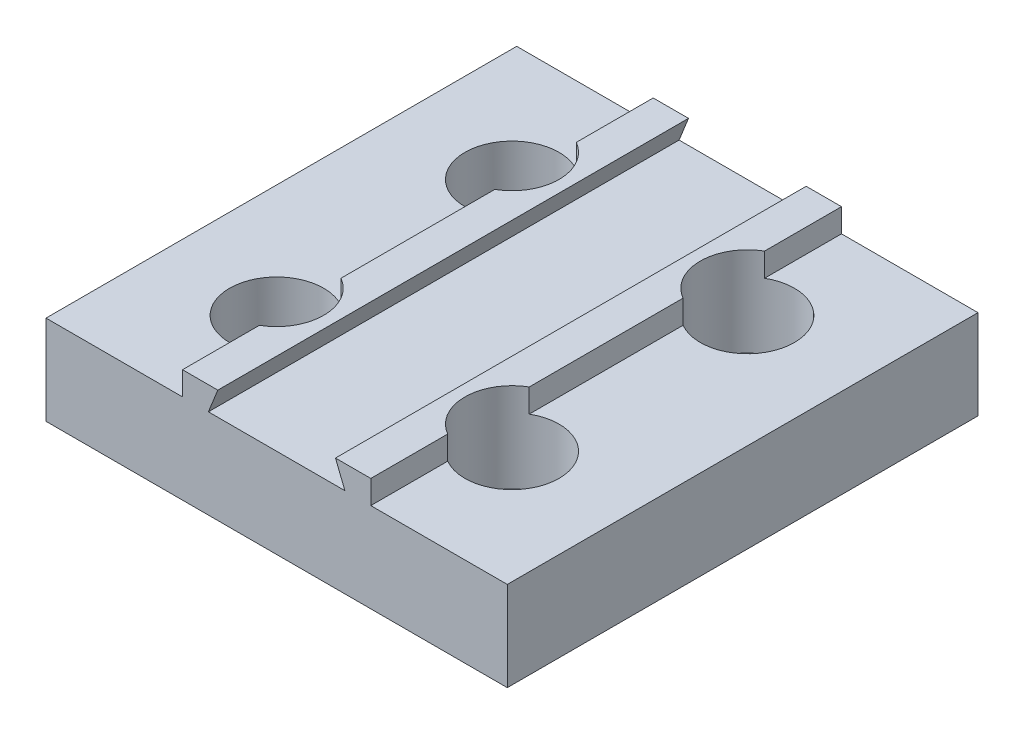
ISO-10303-21;
HEADER;
FILE_DESCRIPTION(('STEP AP214'),'2;1');
FILE_NAME('part.step','',(''),(''),'','','');
FILE_SCHEMA(('AUTOMOTIVE_DESIGN { 1 0 10303 214 1 1 1 1 }'));
ENDSEC;
DATA;
#1=APPLICATION_CONTEXT('core data for automotive mechanical design processes');
#2=APPLICATION_PROTOCOL_DEFINITION('international standard','automotive_design',2000,#1);
#3=PRODUCT_CONTEXT('',#1,'mechanical');
#4=PRODUCT('Part','Part','',(#3));
#5=PRODUCT_RELATED_PRODUCT_CATEGORY('part','',(#4));
#6=PRODUCT_DEFINITION_FORMATION('','',#4);
#7=PRODUCT_DEFINITION_CONTEXT('part definition',#1,'design');
#8=PRODUCT_DEFINITION('design','',#6,#7);
#9=PRODUCT_DEFINITION_SHAPE('','',#8);
#10=(LENGTH_UNIT() NAMED_UNIT(*) SI_UNIT(.MILLI.,.METRE.));
#11=(NAMED_UNIT(*) PLANE_ANGLE_UNIT() SI_UNIT($,.RADIAN.));
#12=(NAMED_UNIT(*) SI_UNIT($,.STERADIAN.) SOLID_ANGLE_UNIT());
#13=UNCERTAINTY_MEASURE_WITH_UNIT(LENGTH_MEASURE(1.E-05),#10,'distance_accuracy_value','');
#14=(GEOMETRIC_REPRESENTATION_CONTEXT(3) GLOBAL_UNCERTAINTY_ASSIGNED_CONTEXT((#13)) GLOBAL_UNIT_ASSIGNED_CONTEXT((#10,
#11,#12)) REPRESENTATION_CONTEXT('',''));
#15=CARTESIAN_POINT('',(0.,0.,0.));
#16=DIRECTION('',(0.,0.,1.));
#17=DIRECTION('',(1.,0.,0.));
#18=AXIS2_PLACEMENT_3D('',#15,#16,#17);
#19=CARTESIAN_POINT('',(10.,12.,25.));
#20=DIRECTION('',(-1.,0.,0.));
#21=DIRECTION('',(0.,0.,1.));
#22=AXIS2_PLACEMENT_3D('',#19,#20,#21);
#23=PLANE('',#22);
#24=DIRECTION('',(0.,-1.,0.));
#25=VECTOR('',#24,1.);
#26=CARTESIAN_POINT('',(10.,12.001,-16.8301270189222));
#27=LINE('',#26,#25);
#28=CARTESIAN_POINT('',(10.,12.,-16.8301270189222));
#29=VERTEX_POINT('',#28);
#30=CARTESIAN_POINT('',(10.,9.5,-16.8301270189222));
#31=VERTEX_POINT('',#30);
#32=EDGE_CURVE('E363',#29,#31,#27,.T.);
#33=ORIENTED_EDGE('',*,*,#32,.T.);
#34=DIRECTION('',(0.,0.,1.));
#35=VECTOR('',#34,1.);
#36=CARTESIAN_POINT('',(10.,9.5,-25.));
#37=LINE('',#36,#35);
#38=CARTESIAN_POINT('',(10.,9.5,-25.));
#39=VERTEX_POINT('',#38);
#40=EDGE_CURVE('E200',#39,#31,#37,.T.);
#41=ORIENTED_EDGE('',*,*,#40,.F.);
#42=DIRECTION('',(0.,-1.,0.));
#43=VECTOR('',#42,1.);
#44=CARTESIAN_POINT('',(10.,12.,-25.));
#45=LINE('',#44,#43);
#46=CARTESIAN_POINT('',(10.,12.,-25.));
#47=VERTEX_POINT('',#46);
#48=EDGE_CURVE('E11',#47,#39,#45,.T.);
#49=ORIENTED_EDGE('',*,*,#48,.F.);
#50=DIRECTION('',(0.,0.,-1.));
#51=VECTOR('',#50,1.);
#52=CARTESIAN_POINT('',(10.,12.,25.));
#53=LINE('',#52,#51);
#54=EDGE_CURVE('E266',#29,#47,#53,.T.);
#55=ORIENTED_EDGE('',*,*,#54,.F.);
#56=EDGE_LOOP('',(#33,#41,#49,#55));
#57=FACE_BOUND('',#56,.T.);
#58=ADVANCED_FACE('F37',(#57),#23,.F.);
#59=DIRECTION('',(0.,-1.,0.));
#60=VECTOR('',#59,1.);
#61=CARTESIAN_POINT('',(10.,12.001,-8.16987298107781));
#62=LINE('',#61,#60);
#63=CARTESIAN_POINT('',(10.,9.5,-8.16987298107781));
#64=VERTEX_POINT('',#63);
#65=CARTESIAN_POINT('',(10.,12.,-8.16987298107781));
#66=VERTEX_POINT('',#65);
#67=EDGE_CURVE('E368',#64,#66,#62,.F.);
#68=ORIENTED_EDGE('',*,*,#67,.T.);
#69=CARTESIAN_POINT('',(10.,12.,8.16987298107781));
#70=VERTEX_POINT('',#69);
#71=EDGE_CURVE('E193',#70,#66,#53,.T.);
#72=ORIENTED_EDGE('',*,*,#71,.F.);
#73=DIRECTION('',(0.,-1.,0.));
#74=VECTOR('',#73,1.);
#75=CARTESIAN_POINT('',(10.,12.001,8.16987298107781));
#76=LINE('',#75,#74);
#77=CARTESIAN_POINT('',(10.,9.5,8.1698729810778));
#78=VERTEX_POINT('',#77);
#79=EDGE_CURVE('E176',#70,#78,#76,.T.);
#80=ORIENTED_EDGE('',*,*,#79,.T.);
#81=EDGE_CURVE('E191',#64,#78,#37,.T.);
#82=ORIENTED_EDGE('',*,*,#81,.F.);
#83=EDGE_LOOP('',(#68,#72,#80,#82));
#84=FACE_BOUND('',#83,.T.);
#85=ADVANCED_FACE('F190',(#84),#23,.F.);
#86=DIRECTION('',(0.,-1.,0.));
#87=VECTOR('',#86,1.);
#88=CARTESIAN_POINT('',(10.,12.001,16.8301270189222));
#89=LINE('',#88,#87);
#90=CARTESIAN_POINT('',(10.,9.5,16.8301270189222));
#91=VERTEX_POINT('',#90);
#92=CARTESIAN_POINT('',(10.,12.,16.8301270189222));
#93=VERTEX_POINT('',#92);
#94=EDGE_CURVE('E179',#91,#93,#89,.F.);
#95=ORIENTED_EDGE('',*,*,#94,.T.);
#96=CARTESIAN_POINT('',(10.,12.,25.));
#97=VERTEX_POINT('',#96);
#98=EDGE_CURVE('E262',#97,#93,#53,.T.);
#99=ORIENTED_EDGE('',*,*,#98,.F.);
#100=DIRECTION('',(0.,-1.,0.));
#101=VECTOR('',#100,1.);
#102=CARTESIAN_POINT('',(10.,12.,25.));
#103=LINE('',#102,#101);
#104=CARTESIAN_POINT('',(10.,9.5,25.));
#105=VERTEX_POINT('',#104);
#106=EDGE_CURVE('E279',#97,#105,#103,.T.);
#107=ORIENTED_EDGE('',*,*,#106,.T.);
#108=EDGE_CURVE('E201',#91,#105,#37,.T.);
#109=ORIENTED_EDGE('',*,*,#108,.F.);
#110=EDGE_LOOP('',(#95,#99,#107,#109));
#111=FACE_BOUND('',#110,.T.);
#112=ADVANCED_FACE('F403',(#111),#23,.F.);
#113=CARTESIAN_POINT('',(-10.,12.,25.));
#114=DIRECTION('',(1.,0.,0.));
#115=DIRECTION('',(0.,0.,-1.));
#116=AXIS2_PLACEMENT_3D('',#113,#114,#115);
#117=PLANE('',#116);
#118=DIRECTION('',(0.,-1.,0.));
#119=VECTOR('',#118,1.);
#120=CARTESIAN_POINT('',(-10.,12.001,16.8301270189222));
#121=LINE('',#120,#119);
#122=CARTESIAN_POINT('',(-10.,12.,16.8301270189222));
#123=VERTEX_POINT('',#122);
#124=CARTESIAN_POINT('',(-10.,9.5,16.8301270189222));
#125=VERTEX_POINT('',#124);
#126=EDGE_CURVE('E351',#123,#125,#121,.T.);
#127=ORIENTED_EDGE('',*,*,#126,.T.);
#128=DIRECTION('',(0.,0.,-1.));
#129=VECTOR('',#128,1.);
#130=CARTESIAN_POINT('',(-10.,9.5,-25.));
#131=LINE('',#130,#129);
#132=CARTESIAN_POINT('',(-10.,9.5,25.));
#133=VERTEX_POINT('',#132);
#134=EDGE_CURVE('E220',#133,#125,#131,.T.);
#135=ORIENTED_EDGE('',*,*,#134,.F.);
#136=DIRECTION('',(0.,-1.,0.));
#137=VECTOR('',#136,1.);
#138=CARTESIAN_POINT('',(-10.,12.,25.));
#139=LINE('',#138,#137);
#140=CARTESIAN_POINT('',(-10.,12.,25.));
#141=VERTEX_POINT('',#140);
#142=EDGE_CURVE('E285',#141,#133,#139,.T.);
#143=ORIENTED_EDGE('',*,*,#142,.F.);
#144=DIRECTION('',(0.,0.,1.));
#145=VECTOR('',#144,1.);
#146=CARTESIAN_POINT('',(-10.,12.,25.));
#147=LINE('',#146,#145);
#148=EDGE_CURVE('E270',#123,#141,#147,.T.);
#149=ORIENTED_EDGE('',*,*,#148,.F.);
#150=EDGE_LOOP('',(#127,#135,#143,#149));
#151=FACE_BOUND('',#150,.T.);
#152=ADVANCED_FACE('F349',(#151),#117,.F.);
#153=DIRECTION('',(0.,-1.,0.));
#154=VECTOR('',#153,1.);
#155=CARTESIAN_POINT('',(-10.,12.001,8.16987298107781));
#156=LINE('',#155,#154);
#157=CARTESIAN_POINT('',(-10.,9.5,8.16987298107781));
#158=VERTEX_POINT('',#157);
#159=CARTESIAN_POINT('',(-10.,12.,8.16987298107781));
#160=VERTEX_POINT('',#159);
#161=EDGE_CURVE('E59',#158,#160,#156,.F.);
#162=ORIENTED_EDGE('',*,*,#161,.T.);
#163=CARTESIAN_POINT('',(-10.,12.,-8.16987298107781));
#164=VERTEX_POINT('',#163);
#165=EDGE_CURVE('E275',#164,#160,#147,.T.);
#166=ORIENTED_EDGE('',*,*,#165,.F.);
#167=DIRECTION('',(0.,-1.,0.));
#168=VECTOR('',#167,1.);
#169=CARTESIAN_POINT('',(-10.,12.001,-8.16987298107781));
#170=LINE('',#169,#168);
#171=CARTESIAN_POINT('',(-10.,9.5,-8.16987298107781));
#172=VERTEX_POINT('',#171);
#173=EDGE_CURVE('E311',#164,#172,#170,.T.);
#174=ORIENTED_EDGE('',*,*,#173,.T.);
#175=EDGE_CURVE('E230',#158,#172,#131,.T.);
#176=ORIENTED_EDGE('',*,*,#175,.F.);
#177=EDGE_LOOP('',(#162,#166,#174,#176));
#178=FACE_BOUND('',#177,.T.);
#179=ADVANCED_FACE('F308',(#178),#117,.F.);
#180=DIRECTION('',(0.,-1.,0.));
#181=VECTOR('',#180,1.);
#182=CARTESIAN_POINT('',(-10.,12.001,-16.8301270189222));
#183=LINE('',#182,#181);
#184=CARTESIAN_POINT('',(-10.,9.5,-16.8301270189222));
#185=VERTEX_POINT('',#184);
#186=CARTESIAN_POINT('',(-10.,12.,-16.8301270189222));
#187=VERTEX_POINT('',#186);
#188=EDGE_CURVE('E51',#185,#187,#183,.F.);
#189=ORIENTED_EDGE('',*,*,#188,.T.);
#190=CARTESIAN_POINT('',(-10.,12.,-25.));
#191=VERTEX_POINT('',#190);
#192=EDGE_CURVE('E271',#191,#187,#147,.T.);
#193=ORIENTED_EDGE('',*,*,#192,.F.);
#194=DIRECTION('',(0.,-1.,0.));
#195=VECTOR('',#194,1.);
#196=CARTESIAN_POINT('',(-10.,12.,-25.));
#197=LINE('',#196,#195);
#198=CARTESIAN_POINT('',(-10.,9.5,-25.));
#199=VERTEX_POINT('',#198);
#200=EDGE_CURVE('E44',#191,#199,#197,.T.);
#201=ORIENTED_EDGE('',*,*,#200,.T.);
#202=EDGE_CURVE('E215',#185,#199,#131,.T.);
#203=ORIENTED_EDGE('',*,*,#202,.F.);
#204=EDGE_LOOP('',(#189,#193,#201,#203));
#205=FACE_BOUND('',#204,.T.);
#206=ADVANCED_FACE('F292',(#205),#117,.F.);
#207=CARTESIAN_POINT('',(0.,12.,0.));
#208=DIRECTION('',(0.,-1.,0.));
#209=DIRECTION('',(0.,0.,-1.));
#210=AXIS2_PLACEMENT_3D('',#207,#208,#209);
#211=PLANE('',#210);
#212=CARTESIAN_POINT('',(12.5,12.,-12.5));
#213=DIRECTION('',(0.,-1.,0.));
#214=DIRECTION('',(0.,0.,-1.));
#215=AXIS2_PLACEMENT_3D('',#212,#213,#214);
#216=CIRCLE('',#215,5.);
#217=EDGE_CURVE('E361',#66,#29,#216,.T.);
#218=ORIENTED_EDGE('',*,*,#217,.T.);
#219=ORIENTED_EDGE('',*,*,#54,.T.);
#220=DIRECTION('',(-1.,0.,0.));
#221=VECTOR('',#220,1.);
#222=CARTESIAN_POINT('',(-10.,12.,-25.));
#223=LINE('',#222,#221);
#224=CARTESIAN_POINT('',(6.25,12.,-25.));
#225=VERTEX_POINT('',#224);
#226=EDGE_CURVE('E267',#47,#225,#223,.T.);
#227=ORIENTED_EDGE('',*,*,#226,.T.);
#228=DIRECTION('',(0.,0.,1.));
#229=VECTOR('',#228,1.);
#230=CARTESIAN_POINT('',(6.25,12.,-25.001));
#231=LINE('',#230,#229);
#232=CARTESIAN_POINT('',(6.25,12.,25.));
#233=VERTEX_POINT('',#232);
#234=EDGE_CURVE('E251',#225,#233,#231,.T.);
#235=ORIENTED_EDGE('',*,*,#234,.T.);
#236=DIRECTION('',(1.,0.,0.));
#237=VECTOR('',#236,1.);
#238=CARTESIAN_POINT('',(-10.,12.,25.));
#239=LINE('',#238,#237);
#240=EDGE_CURVE('E274',#233,#97,#239,.T.);
#241=ORIENTED_EDGE('',*,*,#240,.T.);
#242=ORIENTED_EDGE('',*,*,#98,.T.);
#243=CARTESIAN_POINT('',(12.5,12.,12.5));
#244=DIRECTION('',(0.,-1.,0.));
#245=DIRECTION('',(0.,0.,-1.));
#246=AXIS2_PLACEMENT_3D('',#243,#244,#245);
#247=CIRCLE('',#246,5.);
#248=EDGE_CURVE('E194',#93,#70,#247,.T.);
#249=ORIENTED_EDGE('',*,*,#248,.T.);
#250=ORIENTED_EDGE('',*,*,#71,.T.);
#251=EDGE_LOOP('',(#218,#219,#227,#235,#241,#242,#249,#250));
#252=FACE_BOUND('',#251,.T.);
#253=ADVANCED_FACE('F380',(#252),#211,.F.);
#254=CARTESIAN_POINT('',(-12.5,12.,12.5));
#255=DIRECTION('',(0.,-1.,0.));
#256=DIRECTION('',(0.,0.,-1.));
#257=AXIS2_PLACEMENT_3D('',#254,#255,#256);
#258=CIRCLE('',#257,5.);
#259=EDGE_CURVE('E353',#160,#123,#258,.T.);
#260=ORIENTED_EDGE('',*,*,#259,.T.);
#261=ORIENTED_EDGE('',*,*,#148,.T.);
#262=CARTESIAN_POINT('',(-6.25,12.,25.));
#263=VERTEX_POINT('',#262);
#264=EDGE_CURVE('E276',#141,#263,#239,.T.);
#265=ORIENTED_EDGE('',*,*,#264,.T.);
#266=DIRECTION('',(0.,0.,1.));
#267=VECTOR('',#266,1.);
#268=CARTESIAN_POINT('',(-6.25,12.,-25.001));
#269=LINE('',#268,#267);
#270=CARTESIAN_POINT('',(-6.25,12.,-25.));
#271=VERTEX_POINT('',#270);
#272=EDGE_CURVE('E250',#271,#263,#269,.T.);
#273=ORIENTED_EDGE('',*,*,#272,.F.);
#274=EDGE_CURVE('E265',#271,#191,#223,.T.);
#275=ORIENTED_EDGE('',*,*,#274,.T.);
#276=ORIENTED_EDGE('',*,*,#192,.T.);
#277=CARTESIAN_POINT('',(-12.5,12.,-12.5));
#278=DIRECTION('',(0.,-1.,0.));
#279=DIRECTION('',(0.,0.,-1.));
#280=AXIS2_PLACEMENT_3D('',#277,#278,#279);
#281=CIRCLE('',#280,5.);
#282=EDGE_CURVE('E204',#187,#164,#281,.T.);
#283=ORIENTED_EDGE('',*,*,#282,.T.);
#284=ORIENTED_EDGE('',*,*,#165,.T.);
#285=EDGE_LOOP('',(#260,#261,#265,#273,#275,#276,#283,#284));
#286=FACE_BOUND('',#285,.T.);
#287=ADVANCED_FACE('F426',(#286),#211,.F.);
#288=CARTESIAN_POINT('',(-24.5,9.5,-25.));
#289=DIRECTION('',(0.,-1.,0.));
#290=DIRECTION('',(0.,0.,-1.));
#291=AXIS2_PLACEMENT_3D('',#288,#289,#290);
#292=PLANE('',#291);
#293=CARTESIAN_POINT('',(-12.5,9.5,12.5));
#294=DIRECTION('',(0.,1.,0.));
#295=DIRECTION('',(0.,0.,1.));
#296=AXIS2_PLACEMENT_3D('',#293,#294,#295);
#297=CIRCLE('',#296,5.);
#298=EDGE_CURVE('E305',#158,#125,#297,.T.);
#299=ORIENTED_EDGE('',*,*,#298,.F.);
#300=ORIENTED_EDGE('',*,*,#175,.T.);
#301=CARTESIAN_POINT('',(-12.5,9.5,-12.5));
#302=DIRECTION('',(0.,1.,0.));
#303=DIRECTION('',(0.,0.,1.));
#304=AXIS2_PLACEMENT_3D('',#301,#302,#303);
#305=CIRCLE('',#304,5.);
#306=EDGE_CURVE('E303',#185,#172,#305,.T.);
#307=ORIENTED_EDGE('',*,*,#306,.F.);
#308=ORIENTED_EDGE('',*,*,#202,.T.);
#309=DIRECTION('',(1.,0.,0.));
#310=VECTOR('',#309,1.);
#311=CARTESIAN_POINT('',(-24.5,9.5,-25.));
#312=LINE('',#311,#310);
#313=CARTESIAN_POINT('',(-24.5,9.5,-25.));
#314=VERTEX_POINT('',#313);
#315=EDGE_CURVE('E227',#314,#199,#312,.T.);
#316=ORIENTED_EDGE('',*,*,#315,.F.);
#317=DIRECTION('',(0.,0.,-1.));
#318=VECTOR('',#317,1.);
#319=CARTESIAN_POINT('',(-24.5,9.5,-25.));
#320=LINE('',#319,#318);
#321=CARTESIAN_POINT('',(-24.5,9.5,25.));
#322=VERTEX_POINT('',#321);
#323=EDGE_CURVE('E225',#322,#314,#320,.T.);
#324=ORIENTED_EDGE('',*,*,#323,.F.);
#325=DIRECTION('',(1.,0.,0.));
#326=VECTOR('',#325,1.);
#327=CARTESIAN_POINT('',(-24.5,9.5,25.));
#328=LINE('',#327,#326);
#329=EDGE_CURVE('E233',#322,#133,#328,.T.);
#330=ORIENTED_EDGE('',*,*,#329,.T.);
#331=ORIENTED_EDGE('',*,*,#134,.T.);
#332=EDGE_LOOP('',(#299,#300,#307,#308,#316,#324,#330,#331));
#333=FACE_BOUND('',#332,.T.);
#334=ADVANCED_FACE('F301',(#333),#292,.F.);
#335=CARTESIAN_POINT('',(24.5,9.5,-25.));
#336=DIRECTION('',(0.,-1.,0.));
#337=DIRECTION('',(0.,0.,-1.));
#338=AXIS2_PLACEMENT_3D('',#335,#336,#337);
#339=PLANE('',#338);
#340=CARTESIAN_POINT('',(12.5,9.5,-12.5));
#341=DIRECTION('',(0.,1.,0.));
#342=DIRECTION('',(0.,0.,1.));
#343=AXIS2_PLACEMENT_3D('',#340,#341,#342);
#344=CIRCLE('',#343,5.);
#345=EDGE_CURVE('E199',#64,#31,#344,.T.);
#346=ORIENTED_EDGE('',*,*,#345,.F.);
#347=ORIENTED_EDGE('',*,*,#81,.T.);
#348=CARTESIAN_POINT('',(12.5,9.5,12.5));
#349=DIRECTION('',(0.,1.,0.));
#350=DIRECTION('',(0.,0.,1.));
#351=AXIS2_PLACEMENT_3D('',#348,#349,#350);
#352=CIRCLE('',#351,5.);
#353=EDGE_CURVE('E172',#91,#78,#352,.T.);
#354=ORIENTED_EDGE('',*,*,#353,.F.);
#355=ORIENTED_EDGE('',*,*,#108,.T.);
#356=DIRECTION('',(-1.,0.,0.));
#357=VECTOR('',#356,1.);
#358=CARTESIAN_POINT('',(24.5,9.5,25.));
#359=LINE('',#358,#357);
#360=CARTESIAN_POINT('',(24.5,9.5,25.));
#361=VERTEX_POINT('',#360);
#362=EDGE_CURVE('E209',#361,#105,#359,.T.);
#363=ORIENTED_EDGE('',*,*,#362,.F.);
#364=DIRECTION('',(0.,0.,1.));
#365=VECTOR('',#364,1.);
#366=CARTESIAN_POINT('',(24.5,9.5,-25.));
#367=LINE('',#366,#365);
#368=CARTESIAN_POINT('',(24.5,9.5,-25.));
#369=VERTEX_POINT('',#368);
#370=EDGE_CURVE('E321',#369,#361,#367,.T.);
#371=ORIENTED_EDGE('',*,*,#370,.F.);
#372=DIRECTION('',(-1.,0.,0.));
#373=VECTOR('',#372,1.);
#374=CARTESIAN_POINT('',(24.5,9.5,-25.));
#375=LINE('',#374,#373);
#376=EDGE_CURVE('E212',#369,#39,#375,.T.);
#377=ORIENTED_EDGE('',*,*,#376,.T.);
#378=ORIENTED_EDGE('',*,*,#40,.T.);
#379=EDGE_LOOP('',(#346,#347,#354,#355,#363,#371,#377,#378));
#380=FACE_BOUND('',#379,.T.);
#381=ADVANCED_FACE('F197',(#380),#339,.F.);
#382=CARTESIAN_POINT('',(-10.,12.,-25.));
#383=DIRECTION('',(0.,0.,1.));
#384=DIRECTION('',(1.,0.,0.));
#385=AXIS2_PLACEMENT_3D('',#382,#383,#384);
#386=PLANE('',#385);
#387=DIRECTION('',(-1.,0.,0.));
#388=VECTOR('',#387,1.);
#389=CARTESIAN_POINT('',(0.,9.5,-25.));
#390=LINE('',#389,#388);
#391=CARTESIAN_POINT('',(7.25,9.5,-25.));
#392=VERTEX_POINT('',#391);
#393=CARTESIAN_POINT('',(-7.25,9.5,-25.));
#394=VERTEX_POINT('',#393);
#395=EDGE_CURVE('E236',#392,#394,#390,.T.);
#396=ORIENTED_EDGE('',*,*,#395,.F.);
#397=DIRECTION('',(0.371390676354104,-0.928476690885259,0.));
#398=VECTOR('',#397,1.);
#399=CARTESIAN_POINT('',(6.25,12.,-25.));
#400=LINE('',#399,#398);
#401=EDGE_CURVE('E239',#225,#392,#400,.T.);
#402=ORIENTED_EDGE('',*,*,#401,.F.);
#403=ORIENTED_EDGE('',*,*,#226,.F.);
#404=ORIENTED_EDGE('',*,*,#48,.T.);
#405=ORIENTED_EDGE('',*,*,#376,.F.);
#406=DIRECTION('',(0.,1.,0.));
#407=VECTOR('',#406,1.);
#408=CARTESIAN_POINT('',(24.5,9.5,-25.));
#409=LINE('',#408,#407);
#410=CARTESIAN_POINT('',(24.5,0.,-25.));
#411=VERTEX_POINT('',#410);
#412=EDGE_CURVE('E203',#411,#369,#409,.T.);
#413=ORIENTED_EDGE('',*,*,#412,.F.);
#414=DIRECTION('',(-1.,0.,0.));
#415=VECTOR('',#414,1.);
#416=CARTESIAN_POINT('',(-10.,0.,-25.));
#417=LINE('',#416,#415);
#418=CARTESIAN_POINT('',(-24.5,0.,-25.));
#419=VERTEX_POINT('',#418);
#420=EDGE_CURVE('E261',#411,#419,#417,.T.);
#421=ORIENTED_EDGE('',*,*,#420,.T.);
#422=DIRECTION('',(0.,-1.,0.));
#423=VECTOR('',#422,1.);
#424=CARTESIAN_POINT('',(-24.5,9.5,-25.));
#425=LINE('',#424,#423);
#426=EDGE_CURVE('E216',#314,#419,#425,.T.);
#427=ORIENTED_EDGE('',*,*,#426,.F.);
#428=ORIENTED_EDGE('',*,*,#315,.T.);
#429=ORIENTED_EDGE('',*,*,#200,.F.);
#430=ORIENTED_EDGE('',*,*,#274,.F.);
#431=DIRECTION('',(0.371390676354103,0.928476690885259,0.));
#432=VECTOR('',#431,1.);
#433=CARTESIAN_POINT('',(-7.25,9.5,-25.));
#434=LINE('',#433,#432);
#435=EDGE_CURVE('E254',#394,#271,#434,.T.);
#436=ORIENTED_EDGE('',*,*,#435,.F.);
#437=EDGE_LOOP('',(#396,#402,#403,#404,#405,#413,#421,#427,#428,#429,#430,#436));
#438=FACE_BOUND('',#437,.T.);
#439=ADVANCED_FACE('F298',(#438),#386,.F.);
#440=CARTESIAN_POINT('',(-10.,12.,25.));
#441=DIRECTION('',(0.,0.,-1.));
#442=DIRECTION('',(-1.,0.,0.));
#443=AXIS2_PLACEMENT_3D('',#440,#441,#442);
#444=PLANE('',#443);
#445=ORIENTED_EDGE('',*,*,#240,.F.);
#446=DIRECTION('',(-0.371390676354104,0.928476690885259,0.));
#447=VECTOR('',#446,1.);
#448=CARTESIAN_POINT('',(6.25,12.,25.));
#449=LINE('',#448,#447);
#450=CARTESIAN_POINT('',(7.25,9.5,25.));
#451=VERTEX_POINT('',#450);
#452=EDGE_CURVE('E248',#451,#233,#449,.T.);
#453=ORIENTED_EDGE('',*,*,#452,.F.);
#454=DIRECTION('',(1.,0.,0.));
#455=VECTOR('',#454,1.);
#456=CARTESIAN_POINT('',(0.,9.5,25.));
#457=LINE('',#456,#455);
#458=CARTESIAN_POINT('',(-7.25,9.5,25.));
#459=VERTEX_POINT('',#458);
#460=EDGE_CURVE('E245',#459,#451,#457,.T.);
#461=ORIENTED_EDGE('',*,*,#460,.F.);
#462=DIRECTION('',(-0.371390676354103,-0.928476690885259,0.));
#463=VECTOR('',#462,1.);
#464=CARTESIAN_POINT('',(-7.25,9.5,25.));
#465=LINE('',#464,#463);
#466=EDGE_CURVE('E242',#263,#459,#465,.T.);
#467=ORIENTED_EDGE('',*,*,#466,.F.);
#468=ORIENTED_EDGE('',*,*,#264,.F.);
#469=ORIENTED_EDGE('',*,*,#142,.T.);
#470=ORIENTED_EDGE('',*,*,#329,.F.);
#471=DIRECTION('',(0.,1.,0.));
#472=VECTOR('',#471,1.);
#473=CARTESIAN_POINT('',(-24.5,9.5,25.));
#474=LINE('',#473,#472);
#475=CARTESIAN_POINT('',(-24.5,0.,25.));
#476=VERTEX_POINT('',#475);
#477=EDGE_CURVE('E223',#476,#322,#474,.T.);
#478=ORIENTED_EDGE('',*,*,#477,.F.);
#479=DIRECTION('',(1.,0.,0.));
#480=VECTOR('',#479,1.);
#481=CARTESIAN_POINT('',(-10.,0.,25.));
#482=LINE('',#481,#480);
#483=CARTESIAN_POINT('',(24.5,0.,25.));
#484=VERTEX_POINT('',#483);
#485=EDGE_CURVE('E281',#476,#484,#482,.T.);
#486=ORIENTED_EDGE('',*,*,#485,.T.);
#487=DIRECTION('',(0.,-1.,0.));
#488=VECTOR('',#487,1.);
#489=CARTESIAN_POINT('',(24.5,9.5,25.));
#490=LINE('',#489,#488);
#491=EDGE_CURVE('E322',#361,#484,#490,.T.);
#492=ORIENTED_EDGE('',*,*,#491,.F.);
#493=ORIENTED_EDGE('',*,*,#362,.T.);
#494=ORIENTED_EDGE('',*,*,#106,.F.);
#495=EDGE_LOOP('',(#445,#453,#461,#467,#468,#469,#470,#478,#486,#492,#493,#494));
#496=FACE_BOUND('',#495,.T.);
#497=ADVANCED_FACE('F339',(#496),#444,.F.);
#498=CARTESIAN_POINT('',(0.,0.,0.));
#499=DIRECTION('',(0.,-1.,0.));
#500=DIRECTION('',(0.,0.,-1.));
#501=AXIS2_PLACEMENT_3D('',#498,#499,#500);
#502=PLANE('',#501);
#503=CARTESIAN_POINT('',(12.5,0.,-12.5));
#504=DIRECTION('',(0.,-1.,0.));
#505=DIRECTION('',(0.,0.,-1.));
#506=AXIS2_PLACEMENT_3D('',#503,#504,#505);
#507=CIRCLE('',#506,2.25);
#508=CARTESIAN_POINT('',(12.5,0.,-14.75));
#509=VERTEX_POINT('',#508);
#510=EDGE_CURVE('E580',#509,#509,#507,.F.);
#511=ORIENTED_EDGE('',*,*,#510,.T.);
#512=EDGE_LOOP('',(#511));
#513=FACE_BOUND('',#512,.T.);
#514=CARTESIAN_POINT('',(-12.5,0.,12.5));
#515=DIRECTION('',(0.,-1.,0.));
#516=DIRECTION('',(0.,0.,-1.));
#517=AXIS2_PLACEMENT_3D('',#514,#515,#516);
#518=CIRCLE('',#517,2.25);
#519=CARTESIAN_POINT('',(-12.5,0.,10.25));
#520=VERTEX_POINT('',#519);
#521=EDGE_CURVE('E595',#520,#520,#518,.F.);
#522=ORIENTED_EDGE('',*,*,#521,.T.);
#523=EDGE_LOOP('',(#522));
#524=FACE_BOUND('',#523,.T.);
#525=CARTESIAN_POINT('',(12.5,0.,12.5));
#526=DIRECTION('',(0.,-1.,0.));
#527=DIRECTION('',(0.,0.,-1.));
#528=AXIS2_PLACEMENT_3D('',#525,#526,#527);
#529=CIRCLE('',#528,2.25);
#530=CARTESIAN_POINT('',(12.5,0.,10.25));
#531=VERTEX_POINT('',#530);
#532=EDGE_CURVE('E590',#531,#531,#529,.F.);
#533=ORIENTED_EDGE('',*,*,#532,.T.);
#534=EDGE_LOOP('',(#533));
#535=FACE_BOUND('',#534,.T.);
#536=CARTESIAN_POINT('',(-12.5,0.,-12.5));
#537=DIRECTION('',(0.,-1.,0.));
#538=DIRECTION('',(0.,0.,-1.));
#539=AXIS2_PLACEMENT_3D('',#536,#537,#538);
#540=CIRCLE('',#539,2.25);
#541=CARTESIAN_POINT('',(-12.5,0.,-14.75));
#542=VERTEX_POINT('',#541);
#543=EDGE_CURVE('E583',#542,#542,#540,.F.);
#544=ORIENTED_EDGE('',*,*,#543,.T.);
#545=EDGE_LOOP('',(#544));
#546=FACE_BOUND('',#545,.T.);
#547=ORIENTED_EDGE('',*,*,#420,.F.);
#548=DIRECTION('',(0.,0.,-1.));
#549=VECTOR('',#548,1.);
#550=CARTESIAN_POINT('',(24.5,0.,-25.));
#551=LINE('',#550,#549);
#552=EDGE_CURVE('E207',#484,#411,#551,.T.);
#553=ORIENTED_EDGE('',*,*,#552,.F.);
#554=ORIENTED_EDGE('',*,*,#485,.F.);
#555=DIRECTION('',(0.,0.,1.));
#556=VECTOR('',#555,1.);
#557=CARTESIAN_POINT('',(-24.5,0.,-25.));
#558=LINE('',#557,#556);
#559=EDGE_CURVE('E219',#419,#476,#558,.T.);
#560=ORIENTED_EDGE('',*,*,#559,.F.);
#561=EDGE_LOOP('',(#547,#553,#554,#560));
#562=FACE_BOUND('',#561,.T.);
#563=ADVANCED_FACE('F342',(#513,#524,#535,#546,#562),#502,.T.);
#564=CARTESIAN_POINT('',(6.25,12.,-25.001));
#565=DIRECTION('',(0.928476690885259,0.371390676354104,0.));
#566=DIRECTION('',(-0.371390676354104,0.928476690885259,0.));
#567=AXIS2_PLACEMENT_3D('',#564,#565,#566);
#568=PLANE('',#567);
#569=ORIENTED_EDGE('',*,*,#401,.T.);
#570=DIRECTION('',(0.,0.,1.));
#571=VECTOR('',#570,1.);
#572=CARTESIAN_POINT('',(7.25,9.5,-25.001));
#573=LINE('',#572,#571);
#574=EDGE_CURVE('E255',#392,#451,#573,.T.);
#575=ORIENTED_EDGE('',*,*,#574,.T.);
#576=ORIENTED_EDGE('',*,*,#452,.T.);
#577=ORIENTED_EDGE('',*,*,#234,.F.);
#578=EDGE_LOOP('',(#569,#575,#576,#577));
#579=FACE_BOUND('',#578,.T.);
#580=ADVANCED_FACE('F418',(#579),#568,.F.);
#581=CARTESIAN_POINT('',(0.,9.5,-25.001));
#582=DIRECTION('',(0.,-1.,0.));
#583=DIRECTION('',(0.,0.,-1.));
#584=AXIS2_PLACEMENT_3D('',#581,#582,#583);
#585=PLANE('',#584);
#586=ORIENTED_EDGE('',*,*,#395,.T.);
#587=DIRECTION('',(0.,0.,1.));
#588=VECTOR('',#587,1.);
#589=CARTESIAN_POINT('',(-7.25,9.5,-25.001));
#590=LINE('',#589,#588);
#591=EDGE_CURVE('E257',#394,#459,#590,.T.);
#592=ORIENTED_EDGE('',*,*,#591,.T.);
#593=ORIENTED_EDGE('',*,*,#460,.T.);
#594=ORIENTED_EDGE('',*,*,#574,.F.);
#595=EDGE_LOOP('',(#586,#592,#593,#594));
#596=FACE_BOUND('',#595,.T.);
#597=ADVANCED_FACE('F420',(#596),#585,.F.);
#598=CARTESIAN_POINT('',(-7.25,9.5,-25.001));
#599=DIRECTION('',(-0.928476690885259,0.371390676354103,0.));
#600=DIRECTION('',(-0.371390676354103,-0.928476690885259,0.));
#601=AXIS2_PLACEMENT_3D('',#598,#599,#600);
#602=PLANE('',#601);
#603=ORIENTED_EDGE('',*,*,#435,.T.);
#604=ORIENTED_EDGE('',*,*,#272,.T.);
#605=ORIENTED_EDGE('',*,*,#466,.T.);
#606=ORIENTED_EDGE('',*,*,#591,.F.);
#607=EDGE_LOOP('',(#603,#604,#605,#606));
#608=FACE_BOUND('',#607,.T.);
#609=ADVANCED_FACE('F423',(#608),#602,.F.);
#610=CARTESIAN_POINT('',(-24.5,0.,0.));
#611=DIRECTION('',(-1.,0.,0.));
#612=DIRECTION('',(0.,0.,1.));
#613=AXIS2_PLACEMENT_3D('',#610,#611,#612);
#614=PLANE('',#613);
#615=ORIENTED_EDGE('',*,*,#426,.T.);
#616=ORIENTED_EDGE('',*,*,#559,.T.);
#617=ORIENTED_EDGE('',*,*,#477,.T.);
#618=ORIENTED_EDGE('',*,*,#323,.T.);
#619=EDGE_LOOP('',(#615,#616,#617,#618));
#620=FACE_BOUND('',#619,.T.);
#621=ADVANCED_FACE('F344',(#620),#614,.T.);
#622=CARTESIAN_POINT('',(24.5,0.,0.));
#623=DIRECTION('',(-1.,0.,0.));
#624=DIRECTION('',(0.,0.,1.));
#625=AXIS2_PLACEMENT_3D('',#622,#623,#624);
#626=PLANE('',#625);
#627=ORIENTED_EDGE('',*,*,#412,.T.);
#628=ORIENTED_EDGE('',*,*,#370,.T.);
#629=ORIENTED_EDGE('',*,*,#491,.T.);
#630=ORIENTED_EDGE('',*,*,#552,.T.);
#631=EDGE_LOOP('',(#627,#628,#629,#630));
#632=FACE_BOUND('',#631,.T.);
#633=ADVANCED_FACE('F329',(#632),#626,.F.);
#634=CARTESIAN_POINT('',(12.5,12.001,12.5));
#635=DIRECTION('',(0.,-1.,0.));
#636=DIRECTION('',(0.,0.,-1.));
#637=AXIS2_PLACEMENT_3D('',#634,#635,#636);
#638=CYLINDRICAL_SURFACE('',#637,5.);
#639=ORIENTED_EDGE('',*,*,#248,.F.);
#640=ORIENTED_EDGE('',*,*,#94,.F.);
#641=ORIENTED_EDGE('',*,*,#353,.T.);
#642=ORIENTED_EDGE('',*,*,#79,.F.);
#643=EDGE_LOOP('',(#639,#640,#641,#642));
#644=FACE_BOUND('',#643,.T.);
#645=CARTESIAN_POINT('',(12.5,2.5,12.5));
#646=DIRECTION('',(0.,1.,0.));
#647=DIRECTION('',(0.,0.,1.));
#648=AXIS2_PLACEMENT_3D('',#645,#646,#647);
#649=CIRCLE('',#648,5.);
#650=CARTESIAN_POINT('',(12.5,2.5,17.5));
#651=VERTEX_POINT('',#650);
#652=EDGE_CURVE('E183',#651,#651,#649,.T.);
#653=ORIENTED_EDGE('',*,*,#652,.F.);
#654=EDGE_LOOP('',(#653));
#655=FACE_BOUND('',#654,.T.);
#656=ADVANCED_FACE('F174',(#644,#655),#638,.F.);
#657=CARTESIAN_POINT('',(12.5,2.5,12.5));
#658=DIRECTION('',(0.,1.,0.));
#659=DIRECTION('',(0.,0.,1.));
#660=AXIS2_PLACEMENT_3D('',#657,#658,#659);
#661=PLANE('',#660);
#662=CARTESIAN_POINT('',(12.5,2.5,12.5));
#663=DIRECTION('',(0.,1.,0.));
#664=DIRECTION('',(0.,0.,1.));
#665=AXIS2_PLACEMENT_3D('',#662,#663,#664);
#666=CIRCLE('',#665,2.25);
#667=CARTESIAN_POINT('',(12.5,2.5,14.75));
#668=VERTEX_POINT('',#667);
#669=EDGE_CURVE('E598',#668,#668,#666,.T.);
#670=ORIENTED_EDGE('',*,*,#669,.F.);
#671=EDGE_LOOP('',(#670));
#672=FACE_BOUND('',#671,.T.);
#673=ORIENTED_EDGE('',*,*,#652,.T.);
#674=EDGE_LOOP('',(#673));
#675=FACE_BOUND('',#674,.T.);
#676=ADVANCED_FACE('F387',(#672,#675),#661,.T.);
#677=CARTESIAN_POINT('',(12.5,12.001,-12.5));
#678=DIRECTION('',(0.,-1.,0.));
#679=DIRECTION('',(0.,0.,-1.));
#680=AXIS2_PLACEMENT_3D('',#677,#678,#679);
#681=CYLINDRICAL_SURFACE('',#680,5.);
#682=ORIENTED_EDGE('',*,*,#217,.F.);
#683=ORIENTED_EDGE('',*,*,#67,.F.);
#684=ORIENTED_EDGE('',*,*,#345,.T.);
#685=ORIENTED_EDGE('',*,*,#32,.F.);
#686=EDGE_LOOP('',(#682,#683,#684,#685));
#687=FACE_BOUND('',#686,.T.);
#688=CARTESIAN_POINT('',(12.5,2.5,-12.5));
#689=DIRECTION('',(0.,1.,0.));
#690=DIRECTION('',(0.,0.,1.));
#691=AXIS2_PLACEMENT_3D('',#688,#689,#690);
#692=CIRCLE('',#691,5.);
#693=CARTESIAN_POINT('',(12.5,2.5,-7.5));
#694=VERTEX_POINT('',#693);
#695=EDGE_CURVE('E376',#694,#694,#692,.T.);
#696=ORIENTED_EDGE('',*,*,#695,.F.);
#697=EDGE_LOOP('',(#696));
#698=FACE_BOUND('',#697,.T.);
#699=ADVANCED_FACE('F383',(#687,#698),#681,.F.);
#700=CARTESIAN_POINT('',(12.5,2.5,-12.5));
#701=DIRECTION('',(0.,1.,0.));
#702=DIRECTION('',(0.,0.,1.));
#703=AXIS2_PLACEMENT_3D('',#700,#701,#702);
#704=PLANE('',#703);
#705=CARTESIAN_POINT('',(12.5,2.5,-12.5));
#706=DIRECTION('',(0.,1.,0.));
#707=DIRECTION('',(0.,0.,1.));
#708=AXIS2_PLACEMENT_3D('',#705,#706,#707);
#709=CIRCLE('',#708,2.25);
#710=CARTESIAN_POINT('',(12.5,2.5,-10.25));
#711=VERTEX_POINT('',#710);
#712=EDGE_CURVE('E582',#711,#711,#709,.T.);
#713=ORIENTED_EDGE('',*,*,#712,.F.);
#714=EDGE_LOOP('',(#713));
#715=FACE_BOUND('',#714,.T.);
#716=ORIENTED_EDGE('',*,*,#695,.T.);
#717=EDGE_LOOP('',(#716));
#718=FACE_BOUND('',#717,.T.);
#719=ADVANCED_FACE('F386',(#715,#718),#704,.T.);
#720=CARTESIAN_POINT('',(-12.5,12.001,-12.5));
#721=DIRECTION('',(0.,-1.,0.));
#722=DIRECTION('',(0.,0.,-1.));
#723=AXIS2_PLACEMENT_3D('',#720,#721,#722);
#724=CYLINDRICAL_SURFACE('',#723,5.);
#725=ORIENTED_EDGE('',*,*,#282,.F.);
#726=ORIENTED_EDGE('',*,*,#188,.F.);
#727=ORIENTED_EDGE('',*,*,#306,.T.);
#728=ORIENTED_EDGE('',*,*,#173,.F.);
#729=EDGE_LOOP('',(#725,#726,#727,#728));
#730=FACE_BOUND('',#729,.T.);
#731=CARTESIAN_POINT('',(-12.5,2.5,-12.5));
#732=DIRECTION('',(0.,1.,0.));
#733=DIRECTION('',(0.,0.,1.));
#734=AXIS2_PLACEMENT_3D('',#731,#732,#733);
#735=CIRCLE('',#734,5.);
#736=CARTESIAN_POINT('',(-12.5,2.5,-7.5));
#737=VERTEX_POINT('',#736);
#738=EDGE_CURVE('E315',#737,#737,#735,.T.);
#739=ORIENTED_EDGE('',*,*,#738,.F.);
#740=EDGE_LOOP('',(#739));
#741=FACE_BOUND('',#740,.T.);
#742=ADVANCED_FACE('F392',(#730,#741),#724,.F.);
#743=CARTESIAN_POINT('',(-12.5,2.5,-12.5));
#744=DIRECTION('',(0.,1.,0.));
#745=DIRECTION('',(0.,0.,1.));
#746=AXIS2_PLACEMENT_3D('',#743,#744,#745);
#747=PLANE('',#746);
#748=CARTESIAN_POINT('',(-12.5,2.5,-12.5));
#749=DIRECTION('',(0.,1.,0.));
#750=DIRECTION('',(0.,0.,1.));
#751=AXIS2_PLACEMENT_3D('',#748,#749,#750);
#752=CIRCLE('',#751,2.25);
#753=CARTESIAN_POINT('',(-12.5,2.5,-10.25));
#754=VERTEX_POINT('',#753);
#755=EDGE_CURVE('E184',#754,#754,#752,.T.);
#756=ORIENTED_EDGE('',*,*,#755,.F.);
#757=EDGE_LOOP('',(#756));
#758=FACE_BOUND('',#757,.T.);
#759=ORIENTED_EDGE('',*,*,#738,.T.);
#760=EDGE_LOOP('',(#759));
#761=FACE_BOUND('',#760,.T.);
#762=ADVANCED_FACE('F398',(#758,#761),#747,.T.);
#763=CARTESIAN_POINT('',(-12.5,12.001,12.5));
#764=DIRECTION('',(0.,-1.,0.));
#765=DIRECTION('',(0.,0.,-1.));
#766=AXIS2_PLACEMENT_3D('',#763,#764,#765);
#767=CYLINDRICAL_SURFACE('',#766,5.);
#768=ORIENTED_EDGE('',*,*,#259,.F.);
#769=ORIENTED_EDGE('',*,*,#161,.F.);
#770=ORIENTED_EDGE('',*,*,#298,.T.);
#771=ORIENTED_EDGE('',*,*,#126,.F.);
#772=EDGE_LOOP('',(#768,#769,#770,#771));
#773=FACE_BOUND('',#772,.T.);
#774=CARTESIAN_POINT('',(-12.5,2.5,12.5));
#775=DIRECTION('',(0.,1.,0.));
#776=DIRECTION('',(0.,0.,1.));
#777=AXIS2_PLACEMENT_3D('',#774,#775,#776);
#778=CIRCLE('',#777,5.);
#779=CARTESIAN_POINT('',(-12.5,2.5,17.5));
#780=VERTEX_POINT('',#779);
#781=EDGE_CURVE('E356',#780,#780,#778,.T.);
#782=ORIENTED_EDGE('',*,*,#781,.F.);
#783=EDGE_LOOP('',(#782));
#784=FACE_BOUND('',#783,.T.);
#785=ADVANCED_FACE('F431',(#773,#784),#767,.F.);
#786=CARTESIAN_POINT('',(-12.5,2.5,12.5));
#787=DIRECTION('',(0.,1.,0.));
#788=DIRECTION('',(0.,0.,1.));
#789=AXIS2_PLACEMENT_3D('',#786,#787,#788);
#790=PLANE('',#789);
#791=CARTESIAN_POINT('',(-12.5,2.5,12.5));
#792=DIRECTION('',(0.,1.,0.));
#793=DIRECTION('',(0.,0.,1.));
#794=AXIS2_PLACEMENT_3D('',#791,#792,#793);
#795=CIRCLE('',#794,2.25);
#796=CARTESIAN_POINT('',(-12.5,2.5,14.75));
#797=VERTEX_POINT('',#796);
#798=EDGE_CURVE('E587',#797,#797,#795,.T.);
#799=ORIENTED_EDGE('',*,*,#798,.F.);
#800=EDGE_LOOP('',(#799));
#801=FACE_BOUND('',#800,.T.);
#802=ORIENTED_EDGE('',*,*,#781,.T.);
#803=EDGE_LOOP('',(#802));
#804=FACE_BOUND('',#803,.T.);
#805=ADVANCED_FACE('F437',(#801,#804),#790,.T.);
#806=CARTESIAN_POINT('',(-12.5,-0.00100000000000013,-12.5));
#807=DIRECTION('',(0.,1.,0.));
#808=DIRECTION('',(0.,0.,1.));
#809=AXIS2_PLACEMENT_3D('',#806,#807,#808);
#810=CYLINDRICAL_SURFACE('',#809,2.25);
#811=ORIENTED_EDGE('',*,*,#543,.F.);
#812=EDGE_LOOP('',(#811));
#813=FACE_BOUND('',#812,.T.);
#814=ORIENTED_EDGE('',*,*,#755,.T.);
#815=EDGE_LOOP('',(#814));
#816=FACE_BOUND('',#815,.T.);
#817=ADVANCED_FACE('F534',(#813,#816),#810,.F.);
#818=CARTESIAN_POINT('',(12.5,-0.00100000000000013,12.5));
#819=DIRECTION('',(0.,1.,0.));
#820=DIRECTION('',(0.,0.,1.));
#821=AXIS2_PLACEMENT_3D('',#818,#819,#820);
#822=CYLINDRICAL_SURFACE('',#821,2.25);
#823=ORIENTED_EDGE('',*,*,#532,.F.);
#824=EDGE_LOOP('',(#823));
#825=FACE_BOUND('',#824,.T.);
#826=ORIENTED_EDGE('',*,*,#669,.T.);
#827=EDGE_LOOP('',(#826));
#828=FACE_BOUND('',#827,.T.);
#829=ADVANCED_FACE('F540',(#825,#828),#822,.F.);
#830=CARTESIAN_POINT('',(-12.5,-0.00100000000000013,12.5));
#831=DIRECTION('',(0.,1.,0.));
#832=DIRECTION('',(0.,0.,1.));
#833=AXIS2_PLACEMENT_3D('',#830,#831,#832);
#834=CYLINDRICAL_SURFACE('',#833,2.25);
#835=ORIENTED_EDGE('',*,*,#521,.F.);
#836=EDGE_LOOP('',(#835));
#837=FACE_BOUND('',#836,.T.);
#838=ORIENTED_EDGE('',*,*,#798,.T.);
#839=EDGE_LOOP('',(#838));
#840=FACE_BOUND('',#839,.T.);
#841=ADVANCED_FACE('F548',(#837,#840),#834,.F.);
#842=CARTESIAN_POINT('',(12.5,-0.00100000000000013,-12.5));
#843=DIRECTION('',(0.,1.,0.));
#844=DIRECTION('',(0.,0.,1.));
#845=AXIS2_PLACEMENT_3D('',#842,#843,#844);
#846=CYLINDRICAL_SURFACE('',#845,2.25);
#847=ORIENTED_EDGE('',*,*,#510,.F.);
#848=EDGE_LOOP('',(#847));
#849=FACE_BOUND('',#848,.T.);
#850=ORIENTED_EDGE('',*,*,#712,.T.);
#851=EDGE_LOOP('',(#850));
#852=FACE_BOUND('',#851,.T.);
#853=ADVANCED_FACE('F556',(#849,#852),#846,.F.);
#854=CLOSED_SHELL('',(#58,#85,#112,#152,#179,#206,#253,#287,#334,#381,#439,#497,#563,#580,#597,
#609,#621,#633,#656,#676,#699,#719,#742,#762,#785,#805,#817,#829,#841,#853));
#855=MANIFOLD_SOLID_BREP('B2',#854);
#856=ADVANCED_BREP_SHAPE_REPRESENTATION('',(#18,#855),#14);
#857=SHAPE_DEFINITION_REPRESENTATION(#9,#856);
ENDSEC;
END-ISO-10303-21;
